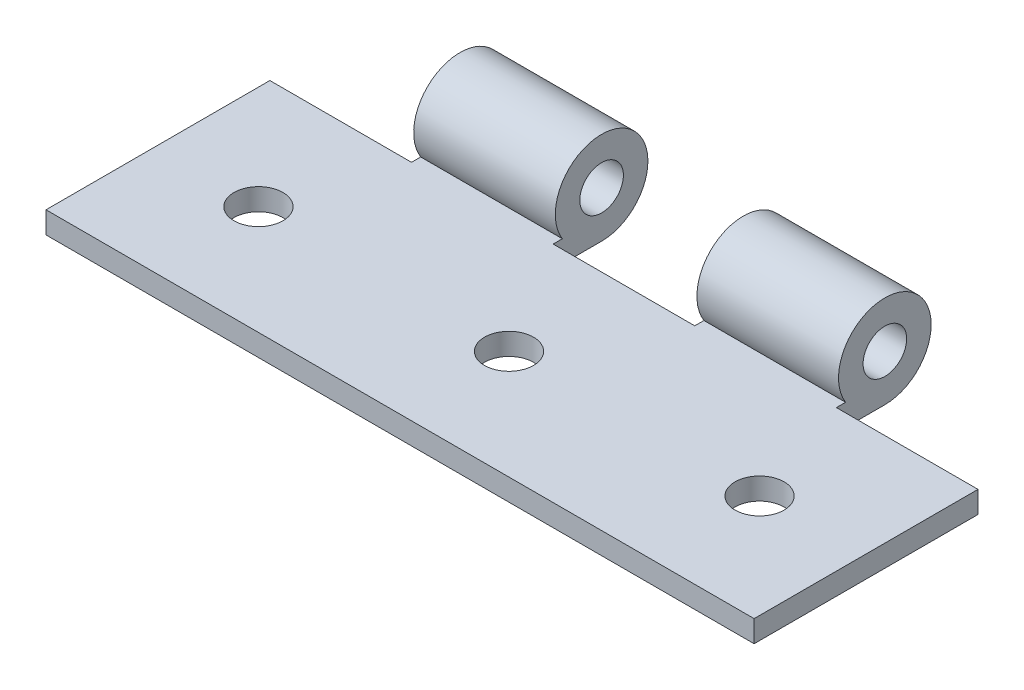
ISO-10303-21;
HEADER;
FILE_DESCRIPTION(('STEP AP214'),'2;1');
FILE_NAME('part.step','',(''),(''),'','','');
FILE_SCHEMA(('AUTOMOTIVE_DESIGN { 1 0 10303 214 1 1 1 1 }'));
ENDSEC;
DATA;
#1=APPLICATION_CONTEXT('core data for automotive mechanical design processes');
#2=APPLICATION_PROTOCOL_DEFINITION('international standard','automotive_design',2000,#1);
#3=PRODUCT_CONTEXT('',#1,'mechanical');
#4=PRODUCT('Part','Part','',(#3));
#5=PRODUCT_RELATED_PRODUCT_CATEGORY('part','',(#4));
#6=PRODUCT_DEFINITION_FORMATION('','',#4);
#7=PRODUCT_DEFINITION_CONTEXT('part definition',#1,'design');
#8=PRODUCT_DEFINITION('design','',#6,#7);
#9=PRODUCT_DEFINITION_SHAPE('','',#8);
#10=(LENGTH_UNIT() NAMED_UNIT(*) SI_UNIT(.MILLI.,.METRE.));
#11=(NAMED_UNIT(*) PLANE_ANGLE_UNIT() SI_UNIT($,.RADIAN.));
#12=(NAMED_UNIT(*) SI_UNIT($,.STERADIAN.) SOLID_ANGLE_UNIT());
#13=UNCERTAINTY_MEASURE_WITH_UNIT(LENGTH_MEASURE(1.E-05),#10,'distance_accuracy_value','');
#14=(GEOMETRIC_REPRESENTATION_CONTEXT(3) GLOBAL_UNCERTAINTY_ASSIGNED_CONTEXT((#13)) GLOBAL_UNIT_ASSIGNED_CONTEXT((#10,
#11,#12)) REPRESENTATION_CONTEXT('',''));
#15=CARTESIAN_POINT('',(0.,0.,0.));
#16=DIRECTION('',(0.,0.,1.));
#17=DIRECTION('',(1.,0.,0.));
#18=AXIS2_PLACEMENT_3D('',#15,#16,#17);
#19=CARTESIAN_POINT('',(23.,2.,30.));
#20=DIRECTION('',(0.,1.,0.));
#21=DIRECTION('',(0.,0.,1.));
#22=AXIS2_PLACEMENT_3D('',#19,#20,#21);
#23=CYLINDRICAL_SURFACE('',#22,2.25);
#24=CARTESIAN_POINT('',(23.,0.,30.));
#25=DIRECTION('',(0.,1.,0.));
#26=DIRECTION('',(0.,0.,1.));
#27=AXIS2_PLACEMENT_3D('',#24,#25,#26);
#28=CIRCLE('',#27,2.25);
#29=CARTESIAN_POINT('',(23.,0.,32.25));
#30=VERTEX_POINT('',#29);
#31=EDGE_CURVE('E284',#30,#30,#28,.T.);
#32=ORIENTED_EDGE('',*,*,#31,.F.);
#33=EDGE_LOOP('',(#32));
#34=FACE_BOUND('',#33,.T.);
#35=CARTESIAN_POINT('',(23.,2.,30.));
#36=DIRECTION('',(0.,1.,0.));
#37=DIRECTION('',(0.,0.,1.));
#38=AXIS2_PLACEMENT_3D('',#35,#36,#37);
#39=CIRCLE('',#38,2.25);
#40=CARTESIAN_POINT('',(23.,2.,32.25));
#41=VERTEX_POINT('',#40);
#42=EDGE_CURVE('E332',#41,#41,#39,.T.);
#43=ORIENTED_EDGE('',*,*,#42,.T.);
#44=EDGE_LOOP('',(#43));
#45=FACE_BOUND('',#44,.T.);
#46=ADVANCED_FACE('F17',(#34,#45),#23,.F.);
#47=CARTESIAN_POINT('',(46.,2.,30.));
#48=DIRECTION('',(0.,1.,0.));
#49=DIRECTION('',(0.,0.,1.));
#50=AXIS2_PLACEMENT_3D('',#47,#48,#49);
#51=CYLINDRICAL_SURFACE('',#50,2.25);
#52=CARTESIAN_POINT('',(46.,0.,30.));
#53=DIRECTION('',(0.,1.,0.));
#54=DIRECTION('',(0.,0.,1.));
#55=AXIS2_PLACEMENT_3D('',#52,#53,#54);
#56=CIRCLE('',#55,2.25);
#57=CARTESIAN_POINT('',(46.,0.,32.25));
#58=VERTEX_POINT('',#57);
#59=EDGE_CURVE('E277',#58,#58,#56,.T.);
#60=ORIENTED_EDGE('',*,*,#59,.F.);
#61=EDGE_LOOP('',(#60));
#62=FACE_BOUND('',#61,.T.);
#63=CARTESIAN_POINT('',(46.,2.,30.));
#64=DIRECTION('',(0.,1.,0.));
#65=DIRECTION('',(0.,0.,1.));
#66=AXIS2_PLACEMENT_3D('',#63,#64,#65);
#67=CIRCLE('',#66,2.25);
#68=CARTESIAN_POINT('',(46.,2.,32.25));
#69=VERTEX_POINT('',#68);
#70=EDGE_CURVE('E161',#69,#69,#67,.T.);
#71=ORIENTED_EDGE('',*,*,#70,.T.);
#72=EDGE_LOOP('',(#71));
#73=FACE_BOUND('',#72,.T.);
#74=ADVANCED_FACE('F343',(#62,#73),#51,.F.);
#75=CARTESIAN_POINT('',(0.,2.,30.));
#76=DIRECTION('',(0.,1.,0.));
#77=DIRECTION('',(0.,0.,1.));
#78=AXIS2_PLACEMENT_3D('',#75,#76,#77);
#79=CYLINDRICAL_SURFACE('',#78,2.25);
#80=CARTESIAN_POINT('',(0.,0.,30.));
#81=DIRECTION('',(0.,1.,0.));
#82=DIRECTION('',(0.,0.,1.));
#83=AXIS2_PLACEMENT_3D('',#80,#81,#82);
#84=CIRCLE('',#83,2.25);
#85=CARTESIAN_POINT('',(0.,0.,32.25));
#86=VERTEX_POINT('',#85);
#87=EDGE_CURVE('E272',#86,#86,#84,.T.);
#88=ORIENTED_EDGE('',*,*,#87,.F.);
#89=EDGE_LOOP('',(#88));
#90=FACE_BOUND('',#89,.T.);
#91=CARTESIAN_POINT('',(0.,2.,30.));
#92=DIRECTION('',(0.,1.,0.));
#93=DIRECTION('',(0.,0.,1.));
#94=AXIS2_PLACEMENT_3D('',#91,#92,#93);
#95=CIRCLE('',#94,2.25);
#96=CARTESIAN_POINT('',(0.,2.,32.25));
#97=VERTEX_POINT('',#96);
#98=EDGE_CURVE('E262',#97,#97,#95,.T.);
#99=ORIENTED_EDGE('',*,*,#98,.T.);
#100=EDGE_LOOP('',(#99));
#101=FACE_BOUND('',#100,.T.);
#102=ADVANCED_FACE('F440',(#90,#101),#79,.F.);
#103=CARTESIAN_POINT('',(42.5,8.5,19.45));
#104=DIRECTION('',(0.,0.,-1.));
#105=DIRECTION('',(0.,-1.,0.));
#106=AXIS2_PLACEMENT_3D('',#103,#104,#105);
#107=PLANE('',#106);
#108=DIRECTION('',(0.,-1.,0.));
#109=VECTOR('',#108,1.);
#110=CARTESIAN_POINT('',(55.5,4.25,19.45));
#111=LINE('',#110,#109);
#112=CARTESIAN_POINT('',(55.5,2.,19.45));
#113=VERTEX_POINT('',#112);
#114=CARTESIAN_POINT('',(55.5,0.,19.45));
#115=VERTEX_POINT('',#114);
#116=EDGE_CURVE('E147',#113,#115,#111,.T.);
#117=ORIENTED_EDGE('',*,*,#116,.T.);
#118=DIRECTION('',(1.,0.,0.));
#119=VECTOR('',#118,1.);
#120=CARTESIAN_POINT('',(42.5,0.,19.45));
#121=LINE('',#120,#119);
#122=CARTESIAN_POINT('',(42.5,0.,19.45));
#123=VERTEX_POINT('',#122);
#124=EDGE_CURVE('E245',#123,#115,#121,.T.);
#125=ORIENTED_EDGE('',*,*,#124,.F.);
#126=DIRECTION('',(0.,-1.,0.));
#127=VECTOR('',#126,1.);
#128=CARTESIAN_POINT('',(42.5,8.5,19.45));
#129=LINE('',#128,#127);
#130=CARTESIAN_POINT('',(42.5,2.,19.45));
#131=VERTEX_POINT('',#130);
#132=EDGE_CURVE('E11',#131,#123,#129,.T.);
#133=ORIENTED_EDGE('',*,*,#132,.F.);
#134=DIRECTION('',(-1.,0.,0.));
#135=VECTOR('',#134,1.);
#136=CARTESIAN_POINT('',(-9.5,2.,19.45));
#137=LINE('',#136,#135);
#138=EDGE_CURVE('E276',#113,#131,#137,.T.);
#139=ORIENTED_EDGE('',*,*,#138,.F.);
#140=EDGE_LOOP('',(#117,#125,#133,#139));
#141=FACE_BOUND('',#140,.T.);
#142=ADVANCED_FACE('F357',(#141),#107,.T.);
#143=CARTESIAN_POINT('',(42.5,8.5,19.45));
#144=DIRECTION('',(1.,0.,0.));
#145=DIRECTION('',(0.,1.,0.));
#146=AXIS2_PLACEMENT_3D('',#143,#144,#145);
#147=PLANE('',#146);
#148=CARTESIAN_POINT('',(42.5,4.25,15.));
#149=DIRECTION('',(-1.,0.,0.));
#150=DIRECTION('',(0.,0.,-1.));
#151=AXIS2_PLACEMENT_3D('',#148,#149,#150);
#152=CIRCLE('',#151,2.);
#153=CARTESIAN_POINT('',(42.5,4.25,13.));
#154=VERTEX_POINT('',#153);
#155=EDGE_CURVE('E135',#154,#154,#152,.T.);
#156=ORIENTED_EDGE('',*,*,#155,.T.);
#157=EDGE_LOOP('',(#156));
#158=FACE_BOUND('',#157,.T.);
#159=ORIENTED_EDGE('',*,*,#132,.T.);
#160=DIRECTION('',(0.,0.,1.));
#161=VECTOR('',#160,1.);
#162=CARTESIAN_POINT('',(42.5,0.,19.45));
#163=LINE('',#162,#161);
#164=CARTESIAN_POINT('',(42.5,0.,15.));
#165=VERTEX_POINT('',#164);
#166=EDGE_CURVE('E241',#165,#123,#163,.T.);
#167=ORIENTED_EDGE('',*,*,#166,.F.);
#168=CARTESIAN_POINT('',(42.5,4.25,15.));
#169=DIRECTION('',(-1.,0.,0.));
#170=DIRECTION('',(0.,0.,-1.));
#171=AXIS2_PLACEMENT_3D('',#168,#169,#170);
#172=CIRCLE('',#171,4.25);
#173=CARTESIAN_POINT('',(42.5,2.,18.605551275464));
#174=VERTEX_POINT('',#173);
#175=EDGE_CURVE('E165',#174,#165,#172,.T.);
#176=ORIENTED_EDGE('',*,*,#175,.F.);
#177=DIRECTION('',(0.,0.,-1.));
#178=VECTOR('',#177,1.);
#179=CARTESIAN_POINT('',(42.5,2.,18.605551275464));
#180=LINE('',#179,#178);
#181=EDGE_CURVE('E292',#131,#174,#180,.T.);
#182=ORIENTED_EDGE('',*,*,#181,.F.);
#183=EDGE_LOOP('',(#159,#167,#176,#182));
#184=FACE_BOUND('',#183,.T.);
#185=ADVANCED_FACE('F363',(#158,#184),#147,.T.);
#186=CARTESIAN_POINT('',(3.5,8.5,19.45));
#187=DIRECTION('',(0.,0.,-1.));
#188=DIRECTION('',(0.,-1.,0.));
#189=AXIS2_PLACEMENT_3D('',#186,#187,#188);
#190=PLANE('',#189);
#191=DIRECTION('',(0.,-1.,0.));
#192=VECTOR('',#191,1.);
#193=CARTESIAN_POINT('',(3.5,8.5,19.45));
#194=LINE('',#193,#192);
#195=CARTESIAN_POINT('',(3.5,2.,19.45));
#196=VERTEX_POINT('',#195);
#197=CARTESIAN_POINT('',(3.5,0.,19.45));
#198=VERTEX_POINT('',#197);
#199=EDGE_CURVE('E20',#196,#198,#194,.T.);
#200=ORIENTED_EDGE('',*,*,#199,.T.);
#201=DIRECTION('',(1.,0.,0.));
#202=VECTOR('',#201,1.);
#203=CARTESIAN_POINT('',(3.5,0.,19.45));
#204=LINE('',#203,#202);
#205=CARTESIAN_POINT('',(-9.5,0.,19.45));
#206=VERTEX_POINT('',#205);
#207=EDGE_CURVE('E208',#206,#198,#204,.T.);
#208=ORIENTED_EDGE('',*,*,#207,.F.);
#209=DIRECTION('',(0.,-1.,0.));
#210=VECTOR('',#209,1.);
#211=CARTESIAN_POINT('',(-9.5,4.25,19.45));
#212=LINE('',#211,#210);
#213=CARTESIAN_POINT('',(-9.5,2.,19.45));
#214=VERTEX_POINT('',#213);
#215=EDGE_CURVE('E180',#214,#206,#212,.T.);
#216=ORIENTED_EDGE('',*,*,#215,.F.);
#217=DIRECTION('',(-1.,0.,0.));
#218=VECTOR('',#217,1.);
#219=CARTESIAN_POINT('',(-9.5,2.,19.45));
#220=LINE('',#219,#218);
#221=EDGE_CURVE('E211',#196,#214,#220,.T.);
#222=ORIENTED_EDGE('',*,*,#221,.F.);
#223=EDGE_LOOP('',(#200,#208,#216,#222));
#224=FACE_BOUND('',#223,.T.);
#225=ADVANCED_FACE('F206',(#224),#190,.T.);
#226=CARTESIAN_POINT('',(3.5,8.5,19.45));
#227=DIRECTION('',(-1.,0.,0.));
#228=DIRECTION('',(0.,0.,1.));
#229=AXIS2_PLACEMENT_3D('',#226,#227,#228);
#230=PLANE('',#229);
#231=CARTESIAN_POINT('',(3.5,4.25,15.));
#232=DIRECTION('',(1.,0.,0.));
#233=DIRECTION('',(0.,0.,1.));
#234=AXIS2_PLACEMENT_3D('',#231,#232,#233);
#235=CIRCLE('',#234,2.);
#236=CARTESIAN_POINT('',(3.5,4.25,17.));
#237=VERTEX_POINT('',#236);
#238=EDGE_CURVE('E166',#237,#237,#235,.T.);
#239=ORIENTED_EDGE('',*,*,#238,.T.);
#240=EDGE_LOOP('',(#239));
#241=FACE_BOUND('',#240,.T.);
#242=DIRECTION('',(0.,0.,-1.));
#243=VECTOR('',#242,1.);
#244=CARTESIAN_POINT('',(3.5,0.,19.45));
#245=LINE('',#244,#243);
#246=CARTESIAN_POINT('',(3.5,0.,15.));
#247=VERTEX_POINT('',#246);
#248=EDGE_CURVE('E217',#198,#247,#245,.T.);
#249=ORIENTED_EDGE('',*,*,#248,.F.);
#250=ORIENTED_EDGE('',*,*,#199,.F.);
#251=DIRECTION('',(0.,0.,1.));
#252=VECTOR('',#251,1.);
#253=CARTESIAN_POINT('',(3.5,2.,18.605551275464));
#254=LINE('',#253,#252);
#255=CARTESIAN_POINT('',(3.5,2.,18.605551275464));
#256=VERTEX_POINT('',#255);
#257=EDGE_CURVE('E297',#256,#196,#254,.T.);
#258=ORIENTED_EDGE('',*,*,#257,.F.);
#259=CARTESIAN_POINT('',(3.5,4.25,15.));
#260=DIRECTION('',(1.,0.,0.));
#261=DIRECTION('',(0.,0.,1.));
#262=AXIS2_PLACEMENT_3D('',#259,#260,#261);
#263=CIRCLE('',#262,4.25);
#264=EDGE_CURVE('E172',#247,#256,#263,.T.);
#265=ORIENTED_EDGE('',*,*,#264,.F.);
#266=EDGE_LOOP('',(#249,#250,#258,#265));
#267=FACE_BOUND('',#266,.T.);
#268=ADVANCED_FACE('F218',(#241,#267),#230,.T.);
#269=CARTESIAN_POINT('',(29.5,8.5,19.45));
#270=DIRECTION('',(0.,0.,-1.));
#271=DIRECTION('',(0.,-1.,0.));
#272=AXIS2_PLACEMENT_3D('',#269,#270,#271);
#273=PLANE('',#272);
#274=DIRECTION('',(0.,-1.,0.));
#275=VECTOR('',#274,1.);
#276=CARTESIAN_POINT('',(29.5,8.5,19.45));
#277=LINE('',#276,#275);
#278=CARTESIAN_POINT('',(29.5,2.,19.45));
#279=VERTEX_POINT('',#278);
#280=CARTESIAN_POINT('',(29.5,0.,19.45));
#281=VERTEX_POINT('',#280);
#282=EDGE_CURVE('E189',#279,#281,#277,.T.);
#283=ORIENTED_EDGE('',*,*,#282,.T.);
#284=DIRECTION('',(1.,0.,0.));
#285=VECTOR('',#284,1.);
#286=CARTESIAN_POINT('',(29.5,0.,19.45));
#287=LINE('',#286,#285);
#288=CARTESIAN_POINT('',(16.5,0.,19.45));
#289=VERTEX_POINT('',#288);
#290=EDGE_CURVE('E250',#289,#281,#287,.T.);
#291=ORIENTED_EDGE('',*,*,#290,.F.);
#292=DIRECTION('',(0.,-1.,0.));
#293=VECTOR('',#292,1.);
#294=CARTESIAN_POINT('',(16.5,8.5,19.45));
#295=LINE('',#294,#293);
#296=CARTESIAN_POINT('',(16.5,2.,19.45));
#297=VERTEX_POINT('',#296);
#298=EDGE_CURVE('E187',#297,#289,#295,.T.);
#299=ORIENTED_EDGE('',*,*,#298,.F.);
#300=DIRECTION('',(-1.,0.,0.));
#301=VECTOR('',#300,1.);
#302=CARTESIAN_POINT('',(-9.5,2.,19.45));
#303=LINE('',#302,#301);
#304=EDGE_CURVE('E311',#279,#297,#303,.T.);
#305=ORIENTED_EDGE('',*,*,#304,.F.);
#306=EDGE_LOOP('',(#283,#291,#299,#305));
#307=FACE_BOUND('',#306,.T.);
#308=ADVANCED_FACE('F370',(#307),#273,.T.);
#309=CARTESIAN_POINT('',(29.5,8.5,19.45));
#310=DIRECTION('',(-1.,0.,0.));
#311=DIRECTION('',(0.,0.,1.));
#312=AXIS2_PLACEMENT_3D('',#309,#310,#311);
#313=PLANE('',#312);
#314=CARTESIAN_POINT('',(29.5,4.25,15.));
#315=DIRECTION('',(1.,0.,0.));
#316=DIRECTION('',(0.,0.,1.));
#317=AXIS2_PLACEMENT_3D('',#314,#315,#316);
#318=CIRCLE('',#317,2.);
#319=CARTESIAN_POINT('',(29.5,4.25,17.));
#320=VERTEX_POINT('',#319);
#321=EDGE_CURVE('E142',#320,#320,#318,.T.);
#322=ORIENTED_EDGE('',*,*,#321,.T.);
#323=EDGE_LOOP('',(#322));
#324=FACE_BOUND('',#323,.T.);
#325=DIRECTION('',(0.,0.,-1.));
#326=VECTOR('',#325,1.);
#327=CARTESIAN_POINT('',(29.5,0.,19.45));
#328=LINE('',#327,#326);
#329=CARTESIAN_POINT('',(29.5,0.,15.));
#330=VERTEX_POINT('',#329);
#331=EDGE_CURVE('E254',#281,#330,#328,.T.);
#332=ORIENTED_EDGE('',*,*,#331,.F.);
#333=ORIENTED_EDGE('',*,*,#282,.F.);
#334=DIRECTION('',(0.,0.,1.));
#335=VECTOR('',#334,1.);
#336=CARTESIAN_POINT('',(29.5,2.,18.605551275464));
#337=LINE('',#336,#335);
#338=CARTESIAN_POINT('',(29.5,2.,18.605551275464));
#339=VERTEX_POINT('',#338);
#340=EDGE_CURVE('E304',#339,#279,#337,.T.);
#341=ORIENTED_EDGE('',*,*,#340,.F.);
#342=CARTESIAN_POINT('',(29.5,4.25,15.));
#343=DIRECTION('',(1.,0.,0.));
#344=DIRECTION('',(0.,0.,1.));
#345=AXIS2_PLACEMENT_3D('',#342,#343,#344);
#346=CIRCLE('',#345,4.25);
#347=EDGE_CURVE('E157',#330,#339,#346,.T.);
#348=ORIENTED_EDGE('',*,*,#347,.F.);
#349=EDGE_LOOP('',(#332,#333,#341,#348));
#350=FACE_BOUND('',#349,.T.);
#351=ADVANCED_FACE('F143',(#324,#350),#313,.T.);
#352=CARTESIAN_POINT('',(16.5,8.5,19.45));
#353=DIRECTION('',(1.,0.,0.));
#354=DIRECTION('',(0.,0.,-1.));
#355=AXIS2_PLACEMENT_3D('',#352,#353,#354);
#356=PLANE('',#355);
#357=CARTESIAN_POINT('',(16.5,4.25,15.));
#358=DIRECTION('',(-1.,0.,0.));
#359=DIRECTION('',(0.,0.,-1.));
#360=AXIS2_PLACEMENT_3D('',#357,#358,#359);
#361=CIRCLE('',#360,2.);
#362=CARTESIAN_POINT('',(16.5,4.25,13.));
#363=VERTEX_POINT('',#362);
#364=EDGE_CURVE('E39',#363,#363,#361,.T.);
#365=ORIENTED_EDGE('',*,*,#364,.T.);
#366=EDGE_LOOP('',(#365));
#367=FACE_BOUND('',#366,.T.);
#368=CARTESIAN_POINT('',(16.5,4.25,15.));
#369=DIRECTION('',(-1.,0.,0.));
#370=DIRECTION('',(0.,0.,-1.));
#371=AXIS2_PLACEMENT_3D('',#368,#369,#370);
#372=CIRCLE('',#371,4.25);
#373=CARTESIAN_POINT('',(16.5,2.,18.605551275464));
#374=VERTEX_POINT('',#373);
#375=CARTESIAN_POINT('',(16.5,0.,15.));
#376=VERTEX_POINT('',#375);
#377=EDGE_CURVE('E168',#374,#376,#372,.T.);
#378=ORIENTED_EDGE('',*,*,#377,.F.);
#379=DIRECTION('',(0.,0.,-1.));
#380=VECTOR('',#379,1.);
#381=CARTESIAN_POINT('',(16.5,2.,18.6055512754639));
#382=LINE('',#381,#380);
#383=EDGE_CURVE('E315',#297,#374,#382,.T.);
#384=ORIENTED_EDGE('',*,*,#383,.F.);
#385=ORIENTED_EDGE('',*,*,#298,.T.);
#386=DIRECTION('',(0.,0.,1.));
#387=VECTOR('',#386,1.);
#388=CARTESIAN_POINT('',(16.5,0.,19.45));
#389=LINE('',#388,#387);
#390=EDGE_CURVE('E255',#376,#289,#389,.T.);
#391=ORIENTED_EDGE('',*,*,#390,.F.);
#392=EDGE_LOOP('',(#378,#384,#385,#391));
#393=FACE_BOUND('',#392,.T.);
#394=ADVANCED_FACE('F374',(#367,#393),#356,.T.);
#395=CARTESIAN_POINT('',(-9.5,2.,40.));
#396=DIRECTION('',(0.,0.,1.));
#397=DIRECTION('',(1.,0.,0.));
#398=AXIS2_PLACEMENT_3D('',#395,#396,#397);
#399=PLANE('',#398);
#400=DIRECTION('',(1.,0.,0.));
#401=VECTOR('',#400,1.);
#402=CARTESIAN_POINT('',(-9.5,0.,40.));
#403=LINE('',#402,#401);
#404=CARTESIAN_POINT('',(-9.5,0.,40.));
#405=VERTEX_POINT('',#404);
#406=CARTESIAN_POINT('',(55.5,0.,40.));
#407=VERTEX_POINT('',#406);
#408=EDGE_CURVE('E235',#405,#407,#403,.T.);
#409=ORIENTED_EDGE('',*,*,#408,.T.);
#410=DIRECTION('',(0.,-1.,0.));
#411=VECTOR('',#410,1.);
#412=CARTESIAN_POINT('',(55.5,2.,40.));
#413=LINE('',#412,#411);
#414=CARTESIAN_POINT('',(55.5,2.,40.));
#415=VERTEX_POINT('',#414);
#416=EDGE_CURVE('E155',#415,#407,#413,.T.);
#417=ORIENTED_EDGE('',*,*,#416,.F.);
#418=DIRECTION('',(1.,0.,0.));
#419=VECTOR('',#418,1.);
#420=CARTESIAN_POINT('',(-9.5,2.,40.));
#421=LINE('',#420,#419);
#422=CARTESIAN_POINT('',(-9.5,2.,40.));
#423=VERTEX_POINT('',#422);
#424=EDGE_CURVE('E325',#423,#415,#421,.T.);
#425=ORIENTED_EDGE('',*,*,#424,.F.);
#426=DIRECTION('',(0.,-1.,0.));
#427=VECTOR('',#426,1.);
#428=CARTESIAN_POINT('',(-9.5,2.,40.));
#429=LINE('',#428,#427);
#430=EDGE_CURVE('E184',#423,#405,#429,.T.);
#431=ORIENTED_EDGE('',*,*,#430,.T.);
#432=EDGE_LOOP('',(#409,#417,#425,#431));
#433=FACE_BOUND('',#432,.T.);
#434=ADVANCED_FACE('F400',(#433),#399,.T.);
#435=CARTESIAN_POINT('',(-9.5,4.25,15.));
#436=DIRECTION('',(-1.,0.,0.));
#437=DIRECTION('',(0.,0.,1.));
#438=AXIS2_PLACEMENT_3D('',#435,#436,#437);
#439=PLANE('',#438);
#440=DIRECTION('',(0.,0.,1.));
#441=VECTOR('',#440,1.);
#442=CARTESIAN_POINT('',(-9.5,2.,18.605551275464));
#443=LINE('',#442,#441);
#444=EDGE_CURVE('E307',#214,#423,#443,.T.);
#445=ORIENTED_EDGE('',*,*,#444,.F.);
#446=ORIENTED_EDGE('',*,*,#215,.T.);
#447=DIRECTION('',(0.,0.,-1.));
#448=VECTOR('',#447,1.);
#449=CARTESIAN_POINT('',(-9.5,0.,40.));
#450=LINE('',#449,#448);
#451=EDGE_CURVE('E229',#405,#206,#450,.T.);
#452=ORIENTED_EDGE('',*,*,#451,.F.);
#453=ORIENTED_EDGE('',*,*,#430,.F.);
#454=EDGE_LOOP('',(#445,#446,#452,#453));
#455=FACE_BOUND('',#454,.T.);
#456=ADVANCED_FACE('F397',(#455),#439,.T.);
#457=CARTESIAN_POINT('',(-9.5,4.25,15.));
#458=DIRECTION('',(1.,0.,0.));
#459=DIRECTION('',(0.,0.,-1.));
#460=AXIS2_PLACEMENT_3D('',#457,#458,#459);
#461=CYLINDRICAL_SURFACE('',#460,2.);
#462=ORIENTED_EDGE('',*,*,#364,.F.);
#463=EDGE_LOOP('',(#462));
#464=FACE_BOUND('',#463,.T.);
#465=ORIENTED_EDGE('',*,*,#238,.F.);
#466=EDGE_LOOP('',(#465));
#467=FACE_BOUND('',#466,.T.);
#468=ADVANCED_FACE('F499',(#464,#467),#461,.F.);
#469=CARTESIAN_POINT('',(-9.5,4.25,15.));
#470=DIRECTION('',(1.,0.,0.));
#471=DIRECTION('',(0.,0.,-1.));
#472=AXIS2_PLACEMENT_3D('',#469,#470,#471);
#473=CYLINDRICAL_SURFACE('',#472,4.25);
#474=DIRECTION('',(1.,0.,0.));
#475=VECTOR('',#474,1.);
#476=CARTESIAN_POINT('',(-9.5,0.,15.));
#477=LINE('',#476,#475);
#478=EDGE_CURVE('E223',#247,#376,#477,.T.);
#479=ORIENTED_EDGE('',*,*,#478,.F.);
#480=ORIENTED_EDGE('',*,*,#264,.T.);
#481=DIRECTION('',(1.,0.,0.));
#482=VECTOR('',#481,1.);
#483=CARTESIAN_POINT('',(-9.5,2.,18.605551275464));
#484=LINE('',#483,#482);
#485=EDGE_CURVE('E300',#256,#374,#484,.T.);
#486=ORIENTED_EDGE('',*,*,#485,.T.);
#487=ORIENTED_EDGE('',*,*,#377,.T.);
#488=EDGE_LOOP('',(#479,#480,#486,#487));
#489=FACE_BOUND('',#488,.T.);
#490=ADVANCED_FACE('F379',(#489),#473,.T.);
#491=CARTESIAN_POINT('',(55.5,4.25,15.));
#492=DIRECTION('',(-1.,0.,0.));
#493=DIRECTION('',(0.,0.,1.));
#494=AXIS2_PLACEMENT_3D('',#491,#492,#493);
#495=PLANE('',#494);
#496=ORIENTED_EDGE('',*,*,#116,.F.);
#497=DIRECTION('',(0.,0.,1.));
#498=VECTOR('',#497,1.);
#499=CARTESIAN_POINT('',(55.5,2.,18.605551275464));
#500=LINE('',#499,#498);
#501=EDGE_CURVE('E329',#113,#415,#500,.T.);
#502=ORIENTED_EDGE('',*,*,#501,.T.);
#503=ORIENTED_EDGE('',*,*,#416,.T.);
#504=DIRECTION('',(0.,0.,-1.));
#505=VECTOR('',#504,1.);
#506=CARTESIAN_POINT('',(55.5,0.,40.));
#507=LINE('',#506,#505);
#508=EDGE_CURVE('E249',#407,#115,#507,.T.);
#509=ORIENTED_EDGE('',*,*,#508,.T.);
#510=EDGE_LOOP('',(#496,#502,#503,#509));
#511=FACE_BOUND('',#510,.T.);
#512=ADVANCED_FACE('F403',(#511),#495,.F.);
#513=CARTESIAN_POINT('',(-9.5,4.25,15.));
#514=DIRECTION('',(1.,0.,0.));
#515=DIRECTION('',(0.,0.,-1.));
#516=AXIS2_PLACEMENT_3D('',#513,#514,#515);
#517=CYLINDRICAL_SURFACE('',#516,2.);
#518=ORIENTED_EDGE('',*,*,#321,.F.);
#519=EDGE_LOOP('',(#518));
#520=FACE_BOUND('',#519,.T.);
#521=ORIENTED_EDGE('',*,*,#155,.F.);
#522=EDGE_LOOP('',(#521));
#523=FACE_BOUND('',#522,.T.);
#524=ADVANCED_FACE('F514',(#520,#523),#517,.F.);
#525=CARTESIAN_POINT('',(-9.5,4.25,15.));
#526=DIRECTION('',(1.,0.,0.));
#527=DIRECTION('',(0.,0.,-1.));
#528=AXIS2_PLACEMENT_3D('',#525,#526,#527);
#529=CYLINDRICAL_SURFACE('',#528,4.25);
#530=DIRECTION('',(1.,0.,0.));
#531=VECTOR('',#530,1.);
#532=CARTESIAN_POINT('',(-9.5,2.,18.605551275464));
#533=LINE('',#532,#531);
#534=EDGE_CURVE('E296',#339,#174,#533,.T.);
#535=ORIENTED_EDGE('',*,*,#534,.T.);
#536=ORIENTED_EDGE('',*,*,#175,.T.);
#537=DIRECTION('',(1.,0.,0.));
#538=VECTOR('',#537,1.);
#539=CARTESIAN_POINT('',(-9.5,0.,15.));
#540=LINE('',#539,#538);
#541=EDGE_CURVE('E238',#330,#165,#540,.T.);
#542=ORIENTED_EDGE('',*,*,#541,.F.);
#543=ORIENTED_EDGE('',*,*,#347,.T.);
#544=EDGE_LOOP('',(#535,#536,#542,#543));
#545=FACE_BOUND('',#544,.T.);
#546=ADVANCED_FACE('F348',(#545),#529,.T.);
#547=CARTESIAN_POINT('',(-9.5,2.,18.605551275464));
#548=DIRECTION('',(0.,1.,0.));
#549=DIRECTION('',(0.,0.,-1.));
#550=AXIS2_PLACEMENT_3D('',#547,#548,#549);
#551=PLANE('',#550);
#552=ORIENTED_EDGE('',*,*,#98,.F.);
#553=EDGE_LOOP('',(#552));
#554=FACE_BOUND('',#553,.T.);
#555=ORIENTED_EDGE('',*,*,#70,.F.);
#556=EDGE_LOOP('',(#555));
#557=FACE_BOUND('',#556,.T.);
#558=ORIENTED_EDGE('',*,*,#42,.F.);
#559=EDGE_LOOP('',(#558));
#560=FACE_BOUND('',#559,.T.);
#561=ORIENTED_EDGE('',*,*,#138,.T.);
#562=ORIENTED_EDGE('',*,*,#181,.T.);
#563=ORIENTED_EDGE('',*,*,#534,.F.);
#564=ORIENTED_EDGE('',*,*,#340,.T.);
#565=ORIENTED_EDGE('',*,*,#304,.T.);
#566=ORIENTED_EDGE('',*,*,#383,.T.);
#567=ORIENTED_EDGE('',*,*,#485,.F.);
#568=ORIENTED_EDGE('',*,*,#257,.T.);
#569=ORIENTED_EDGE('',*,*,#221,.T.);
#570=ORIENTED_EDGE('',*,*,#444,.T.);
#571=ORIENTED_EDGE('',*,*,#424,.T.);
#572=ORIENTED_EDGE('',*,*,#501,.F.);
#573=EDGE_LOOP('',(#561,#562,#563,#564,#565,#566,#567,#568,#569,#570,#571,#572));
#574=FACE_BOUND('',#573,.T.);
#575=ADVANCED_FACE('F345',(#554,#557,#560,#574),#551,.T.);
#576=CARTESIAN_POINT('',(-9.5,0.,40.));
#577=DIRECTION('',(0.,-1.,0.));
#578=DIRECTION('',(0.,0.,-1.));
#579=AXIS2_PLACEMENT_3D('',#576,#577,#578);
#580=PLANE('',#579);
#581=ORIENTED_EDGE('',*,*,#87,.T.);
#582=EDGE_LOOP('',(#581));
#583=FACE_BOUND('',#582,.T.);
#584=ORIENTED_EDGE('',*,*,#59,.T.);
#585=EDGE_LOOP('',(#584));
#586=FACE_BOUND('',#585,.T.);
#587=ORIENTED_EDGE('',*,*,#31,.T.);
#588=EDGE_LOOP('',(#587));
#589=FACE_BOUND('',#588,.T.);
#590=ORIENTED_EDGE('',*,*,#541,.T.);
#591=ORIENTED_EDGE('',*,*,#166,.T.);
#592=ORIENTED_EDGE('',*,*,#124,.T.);
#593=ORIENTED_EDGE('',*,*,#508,.F.);
#594=ORIENTED_EDGE('',*,*,#408,.F.);
#595=ORIENTED_EDGE('',*,*,#451,.T.);
#596=ORIENTED_EDGE('',*,*,#207,.T.);
#597=ORIENTED_EDGE('',*,*,#248,.T.);
#598=ORIENTED_EDGE('',*,*,#478,.T.);
#599=ORIENTED_EDGE('',*,*,#390,.T.);
#600=ORIENTED_EDGE('',*,*,#290,.T.);
#601=ORIENTED_EDGE('',*,*,#331,.T.);
#602=EDGE_LOOP('',(#590,#591,#592,#593,#594,#595,#596,#597,#598,#599,#600,#601));
#603=FACE_BOUND('',#602,.T.);
#604=ADVANCED_FACE('F226',(#583,#586,#589,#603),#580,.T.);
#605=CLOSED_SHELL('',(#46,#74,#102,#142,#185,#225,#268,#308,#351,#394,#434,#456,#468,#490,#512,
#524,#546,#575,#604));
#606=MANIFOLD_SOLID_BREP('B1',#605);
#607=ADVANCED_BREP_SHAPE_REPRESENTATION('',(#18,#606),#14);
#608=SHAPE_DEFINITION_REPRESENTATION(#9,#607);
ENDSEC;
END-ISO-10303-21;
